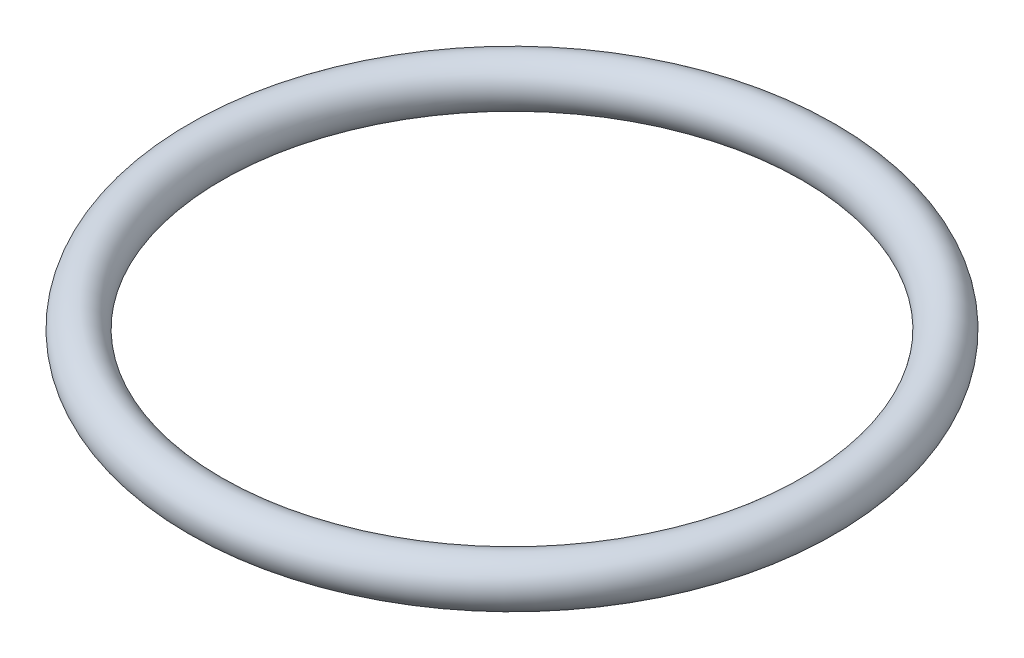
ISO-10303-21;
HEADER;
FILE_DESCRIPTION(('STEP AP214'),'2;1');
FILE_NAME('part.step','',(''),(''),'','','');
FILE_SCHEMA(('AUTOMOTIVE_DESIGN { 1 0 10303 214 1 1 1 1 }'));
ENDSEC;
DATA;
#1=APPLICATION_CONTEXT('core data for automotive mechanical design processes');
#2=APPLICATION_PROTOCOL_DEFINITION('international standard','automotive_design',2000,#1);
#3=PRODUCT_CONTEXT('',#1,'mechanical');
#4=PRODUCT('Part','Part','',(#3));
#5=PRODUCT_RELATED_PRODUCT_CATEGORY('part','',(#4));
#6=PRODUCT_DEFINITION_FORMATION('','',#4);
#7=PRODUCT_DEFINITION_CONTEXT('part definition',#1,'design');
#8=PRODUCT_DEFINITION('design','',#6,#7);
#9=PRODUCT_DEFINITION_SHAPE('','',#8);
#10=(LENGTH_UNIT() NAMED_UNIT(*) SI_UNIT(.MILLI.,.METRE.));
#11=(NAMED_UNIT(*) PLANE_ANGLE_UNIT() SI_UNIT($,.RADIAN.));
#12=(NAMED_UNIT(*) SI_UNIT($,.STERADIAN.) SOLID_ANGLE_UNIT());
#13=UNCERTAINTY_MEASURE_WITH_UNIT(LENGTH_MEASURE(1.E-05),#10,'distance_accuracy_value','');
#14=(GEOMETRIC_REPRESENTATION_CONTEXT(3) GLOBAL_UNCERTAINTY_ASSIGNED_CONTEXT((#13)) GLOBAL_UNIT_ASSIGNED_CONTEXT((#10,
#11,#12)) REPRESENTATION_CONTEXT('',''));
#15=CARTESIAN_POINT('',(0.,0.,0.));
#16=DIRECTION('',(0.,0.,1.));
#17=DIRECTION('',(1.,0.,0.));
#18=AXIS2_PLACEMENT_3D('',#15,#16,#17);
#19=CARTESIAN_POINT('',(0.,0.,0.));
#20=DIRECTION('',(0.,-1.,0.));
#21=DIRECTION('',(0.,0.,-1.));
#22=AXIS2_PLACEMENT_3D('',#19,#20,#21);
#23=TOROIDAL_SURFACE('',#22,23.625,1.775);
#24=CARTESIAN_POINT('',(0.,0.,-25.4));
#25=VERTEX_POINT('',#24);
#26=VERTEX_LOOP('',#25);
#27=FACE_BOUND('',#26,.T.);
#28=ADVANCED_FACE('F30',(#27),#23,.T.);
#29=CLOSED_SHELL('',(#28));
#30=MANIFOLD_SOLID_BREP('B2',#29);
#31=ADVANCED_BREP_SHAPE_REPRESENTATION('',(#18,#30),#14);
#32=SHAPE_DEFINITION_REPRESENTATION(#9,#31);
ENDSEC;
END-ISO-10303-21;
